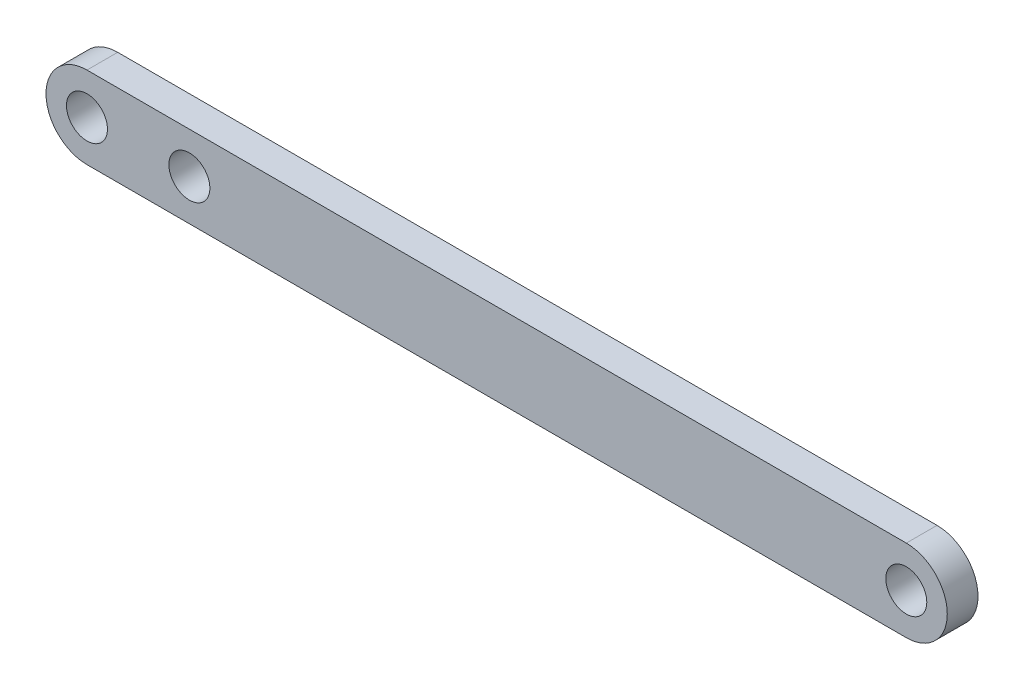
ISO-10303-21;
HEADER;
FILE_DESCRIPTION(('STEP AP214'),'2;1');
FILE_NAME('part.step','',(''),(''),'','','');
FILE_SCHEMA(('AUTOMOTIVE_DESIGN { 1 0 10303 214 1 1 1 1 }'));
ENDSEC;
DATA;
#1=APPLICATION_CONTEXT('core data for automotive mechanical design processes');
#2=APPLICATION_PROTOCOL_DEFINITION('international standard','automotive_design',2000,#1);
#3=PRODUCT_CONTEXT('',#1,'mechanical');
#4=PRODUCT('Part','Part','',(#3));
#5=PRODUCT_RELATED_PRODUCT_CATEGORY('part','',(#4));
#6=PRODUCT_DEFINITION_FORMATION('','',#4);
#7=PRODUCT_DEFINITION_CONTEXT('part definition',#1,'design');
#8=PRODUCT_DEFINITION('design','',#6,#7);
#9=PRODUCT_DEFINITION_SHAPE('','',#8);
#10=(LENGTH_UNIT() NAMED_UNIT(*) SI_UNIT(.MILLI.,.METRE.));
#11=(NAMED_UNIT(*) PLANE_ANGLE_UNIT() SI_UNIT($,.RADIAN.));
#12=(NAMED_UNIT(*) SI_UNIT($,.STERADIAN.) SOLID_ANGLE_UNIT());
#13=UNCERTAINTY_MEASURE_WITH_UNIT(LENGTH_MEASURE(1.E-05),#10,'distance_accuracy_value','');
#14=(GEOMETRIC_REPRESENTATION_CONTEXT(3) GLOBAL_UNCERTAINTY_ASSIGNED_CONTEXT((#13)) GLOBAL_UNIT_ASSIGNED_CONTEXT((#10,
#11,#12)) REPRESENTATION_CONTEXT('',''));
#15=CARTESIAN_POINT('',(0.,0.,0.));
#16=DIRECTION('',(0.,0.,1.));
#17=DIRECTION('',(1.,0.,0.));
#18=AXIS2_PLACEMENT_3D('',#15,#16,#17);
#19=CARTESIAN_POINT('',(0.,0.,1.5));
#20=DIRECTION('',(0.,0.,1.));
#21=DIRECTION('',(1.,0.,0.));
#22=AXIS2_PLACEMENT_3D('',#19,#20,#21);
#23=PLANE('',#22);
#24=CARTESIAN_POINT('',(40.,0.,1.5));
#25=DIRECTION('',(0.,0.,1.));
#26=DIRECTION('',(1.,0.,0.));
#27=AXIS2_PLACEMENT_3D('',#24,#25,#26);
#28=CIRCLE('',#27,0.999999999999998);
#29=CARTESIAN_POINT('',(41.,0.,1.5));
#30=VERTEX_POINT('',#29);
#31=EDGE_CURVE('E116',#30,#30,#28,.T.);
#32=ORIENTED_EDGE('',*,*,#31,.F.);
#33=EDGE_LOOP('',(#32));
#34=FACE_BOUND('',#33,.T.);
#35=CARTESIAN_POINT('',(0.,0.,1.5));
#36=DIRECTION('',(0.,0.,1.));
#37=DIRECTION('',(1.,0.,0.));
#38=AXIS2_PLACEMENT_3D('',#35,#36,#37);
#39=CIRCLE('',#38,2.);
#40=CARTESIAN_POINT('',(0.,2.,1.5));
#41=VERTEX_POINT('',#40);
#42=CARTESIAN_POINT('',(0.,-2.,1.5));
#43=VERTEX_POINT('',#42);
#44=EDGE_CURVE('E86',#41,#43,#39,.T.);
#45=ORIENTED_EDGE('',*,*,#44,.T.);
#46=DIRECTION('',(1.,0.,0.));
#47=VECTOR('',#46,1.);
#48=CARTESIAN_POINT('',(0.,-2.,1.5));
#49=LINE('',#48,#47);
#50=CARTESIAN_POINT('',(40.,-2.,1.5));
#51=VERTEX_POINT('',#50);
#52=EDGE_CURVE('E81',#43,#51,#49,.T.);
#53=ORIENTED_EDGE('',*,*,#52,.T.);
#54=CARTESIAN_POINT('',(40.,0.,1.5));
#55=DIRECTION('',(0.,0.,1.));
#56=DIRECTION('',(1.,0.,0.));
#57=AXIS2_PLACEMENT_3D('',#54,#55,#56);
#58=CIRCLE('',#57,2.);
#59=CARTESIAN_POINT('',(40.,2.,1.5));
#60=VERTEX_POINT('',#59);
#61=EDGE_CURVE('E84',#51,#60,#58,.T.);
#62=ORIENTED_EDGE('',*,*,#61,.T.);
#63=DIRECTION('',(-1.,0.,0.));
#64=VECTOR('',#63,1.);
#65=CARTESIAN_POINT('',(0.,2.,1.5));
#66=LINE('',#65,#64);
#67=EDGE_CURVE('E51',#60,#41,#66,.T.);
#68=ORIENTED_EDGE('',*,*,#67,.T.);
#69=EDGE_LOOP('',(#45,#53,#62,#68));
#70=FACE_BOUND('',#69,.T.);
#71=CARTESIAN_POINT('',(5.,0.,1.5));
#72=DIRECTION('',(0.,0.,1.));
#73=DIRECTION('',(1.,0.,0.));
#74=AXIS2_PLACEMENT_3D('',#71,#72,#73);
#75=CIRCLE('',#74,1.);
#76=CARTESIAN_POINT('',(6.,0.,1.5));
#77=VERTEX_POINT('',#76);
#78=EDGE_CURVE('E101',#77,#77,#75,.T.);
#79=ORIENTED_EDGE('',*,*,#78,.F.);
#80=EDGE_LOOP('',(#79));
#81=FACE_BOUND('',#80,.T.);
#82=CARTESIAN_POINT('',(0.,0.,1.5));
#83=DIRECTION('',(0.,0.,1.));
#84=DIRECTION('',(1.,0.,0.));
#85=AXIS2_PLACEMENT_3D('',#82,#83,#84);
#86=CIRCLE('',#85,1.);
#87=CARTESIAN_POINT('',(1.,0.,1.5));
#88=VERTEX_POINT('',#87);
#89=EDGE_CURVE('E122',#88,#88,#86,.T.);
#90=ORIENTED_EDGE('',*,*,#89,.F.);
#91=EDGE_LOOP('',(#90));
#92=FACE_BOUND('',#91,.T.);
#93=ADVANCED_FACE('F34',(#34,#70,#81,#92),#23,.T.);
#94=CARTESIAN_POINT('',(0.,0.,0.));
#95=DIRECTION('',(0.,0.,1.));
#96=DIRECTION('',(1.,0.,0.));
#97=AXIS2_PLACEMENT_3D('',#94,#95,#96);
#98=PLANE('',#97);
#99=CARTESIAN_POINT('',(0.,0.,0.));
#100=DIRECTION('',(0.,0.,1.));
#101=DIRECTION('',(1.,0.,0.));
#102=AXIS2_PLACEMENT_3D('',#99,#100,#101);
#103=CIRCLE('',#102,2.);
#104=CARTESIAN_POINT('',(0.,2.,0.));
#105=VERTEX_POINT('',#104);
#106=CARTESIAN_POINT('',(0.,-2.,0.));
#107=VERTEX_POINT('',#106);
#108=EDGE_CURVE('E98',#105,#107,#103,.T.);
#109=ORIENTED_EDGE('',*,*,#108,.F.);
#110=DIRECTION('',(-1.,0.,0.));
#111=VECTOR('',#110,1.);
#112=CARTESIAN_POINT('',(0.,2.,0.));
#113=LINE('',#112,#111);
#114=CARTESIAN_POINT('',(40.,2.,0.));
#115=VERTEX_POINT('',#114);
#116=EDGE_CURVE('E74',#115,#105,#113,.T.);
#117=ORIENTED_EDGE('',*,*,#116,.F.);
#118=CARTESIAN_POINT('',(40.,0.,0.));
#119=DIRECTION('',(0.,0.,1.));
#120=DIRECTION('',(1.,0.,0.));
#121=AXIS2_PLACEMENT_3D('',#118,#119,#120);
#122=CIRCLE('',#121,2.);
#123=CARTESIAN_POINT('',(40.,-2.,0.));
#124=VERTEX_POINT('',#123);
#125=EDGE_CURVE('E68',#124,#115,#122,.T.);
#126=ORIENTED_EDGE('',*,*,#125,.F.);
#127=DIRECTION('',(1.,0.,0.));
#128=VECTOR('',#127,1.);
#129=CARTESIAN_POINT('',(0.,-2.,0.));
#130=LINE('',#129,#128);
#131=EDGE_CURVE('E90',#107,#124,#130,.T.);
#132=ORIENTED_EDGE('',*,*,#131,.F.);
#133=EDGE_LOOP('',(#109,#117,#126,#132));
#134=FACE_BOUND('',#133,.T.);
#135=CARTESIAN_POINT('',(5.,0.,0.));
#136=DIRECTION('',(0.,0.,1.));
#137=DIRECTION('',(1.,0.,0.));
#138=AXIS2_PLACEMENT_3D('',#135,#136,#137);
#139=CIRCLE('',#138,1.);
#140=CARTESIAN_POINT('',(6.,0.,0.));
#141=VERTEX_POINT('',#140);
#142=EDGE_CURVE('E113',#141,#141,#139,.T.);
#143=ORIENTED_EDGE('',*,*,#142,.T.);
#144=EDGE_LOOP('',(#143));
#145=FACE_BOUND('',#144,.T.);
#146=CARTESIAN_POINT('',(40.,0.,0.));
#147=DIRECTION('',(0.,0.,1.));
#148=DIRECTION('',(1.,0.,0.));
#149=AXIS2_PLACEMENT_3D('',#146,#147,#148);
#150=CIRCLE('',#149,0.999999999999998);
#151=CARTESIAN_POINT('',(41.,0.,0.));
#152=VERTEX_POINT('',#151);
#153=EDGE_CURVE('E119',#152,#152,#150,.T.);
#154=ORIENTED_EDGE('',*,*,#153,.T.);
#155=EDGE_LOOP('',(#154));
#156=FACE_BOUND('',#155,.T.);
#157=CARTESIAN_POINT('',(0.,0.,0.));
#158=DIRECTION('',(0.,0.,1.));
#159=DIRECTION('',(1.,0.,0.));
#160=AXIS2_PLACEMENT_3D('',#157,#158,#159);
#161=CIRCLE('',#160,1.);
#162=CARTESIAN_POINT('',(1.,0.,0.));
#163=VERTEX_POINT('',#162);
#164=EDGE_CURVE('E125',#163,#163,#161,.T.);
#165=ORIENTED_EDGE('',*,*,#164,.T.);
#166=EDGE_LOOP('',(#165));
#167=FACE_BOUND('',#166,.T.);
#168=ADVANCED_FACE('F109',(#134,#145,#156,#167),#98,.F.);
#169=CARTESIAN_POINT('',(0.,0.,1.5));
#170=DIRECTION('',(0.,0.,-1.));
#171=DIRECTION('',(-1.,0.,0.));
#172=AXIS2_PLACEMENT_3D('',#169,#170,#171);
#173=CYLINDRICAL_SURFACE('',#172,2.);
#174=ORIENTED_EDGE('',*,*,#108,.T.);
#175=DIRECTION('',(0.,0.,-1.));
#176=VECTOR('',#175,1.);
#177=CARTESIAN_POINT('',(0.,-2.,1.5));
#178=LINE('',#177,#176);
#179=EDGE_CURVE('E11',#43,#107,#178,.T.);
#180=ORIENTED_EDGE('',*,*,#179,.F.);
#181=ORIENTED_EDGE('',*,*,#44,.F.);
#182=DIRECTION('',(0.,0.,-1.));
#183=VECTOR('',#182,1.);
#184=CARTESIAN_POINT('',(0.,2.,1.5));
#185=LINE('',#184,#183);
#186=EDGE_CURVE('E94',#41,#105,#185,.T.);
#187=ORIENTED_EDGE('',*,*,#186,.T.);
#188=EDGE_LOOP('',(#174,#180,#181,#187));
#189=FACE_BOUND('',#188,.T.);
#190=ADVANCED_FACE('F36',(#189),#173,.T.);
#191=CARTESIAN_POINT('',(0.,-2.,1.5));
#192=DIRECTION('',(0.,1.,0.));
#193=DIRECTION('',(0.,0.,1.));
#194=AXIS2_PLACEMENT_3D('',#191,#192,#193);
#195=PLANE('',#194);
#196=ORIENTED_EDGE('',*,*,#131,.T.);
#197=DIRECTION('',(0.,0.,-1.));
#198=VECTOR('',#197,1.);
#199=CARTESIAN_POINT('',(40.,-2.,1.5));
#200=LINE('',#199,#198);
#201=EDGE_CURVE('E43',#51,#124,#200,.T.);
#202=ORIENTED_EDGE('',*,*,#201,.F.);
#203=ORIENTED_EDGE('',*,*,#52,.F.);
#204=ORIENTED_EDGE('',*,*,#179,.T.);
#205=EDGE_LOOP('',(#196,#202,#203,#204));
#206=FACE_BOUND('',#205,.T.);
#207=ADVANCED_FACE('F89',(#206),#195,.F.);
#208=CARTESIAN_POINT('',(40.,0.,1.5));
#209=DIRECTION('',(0.,0.,-1.));
#210=DIRECTION('',(-1.,0.,0.));
#211=AXIS2_PLACEMENT_3D('',#208,#209,#210);
#212=CYLINDRICAL_SURFACE('',#211,2.);
#213=ORIENTED_EDGE('',*,*,#125,.T.);
#214=DIRECTION('',(0.,0.,-1.));
#215=VECTOR('',#214,1.);
#216=CARTESIAN_POINT('',(40.,2.,1.5));
#217=LINE('',#216,#215);
#218=EDGE_CURVE('E91',#60,#115,#217,.T.);
#219=ORIENTED_EDGE('',*,*,#218,.F.);
#220=ORIENTED_EDGE('',*,*,#61,.F.);
#221=ORIENTED_EDGE('',*,*,#201,.T.);
#222=EDGE_LOOP('',(#213,#219,#220,#221));
#223=FACE_BOUND('',#222,.T.);
#224=ADVANCED_FACE('F92',(#223),#212,.T.);
#225=CARTESIAN_POINT('',(0.,2.,1.5));
#226=DIRECTION('',(0.,-1.,0.));
#227=DIRECTION('',(0.,0.,-1.));
#228=AXIS2_PLACEMENT_3D('',#225,#226,#227);
#229=PLANE('',#228);
#230=ORIENTED_EDGE('',*,*,#116,.T.);
#231=ORIENTED_EDGE('',*,*,#186,.F.);
#232=ORIENTED_EDGE('',*,*,#67,.F.);
#233=ORIENTED_EDGE('',*,*,#218,.T.);
#234=EDGE_LOOP('',(#230,#231,#232,#233));
#235=FACE_BOUND('',#234,.T.);
#236=ADVANCED_FACE('F106',(#235),#229,.F.);
#237=CARTESIAN_POINT('',(5.,0.,1.5));
#238=DIRECTION('',(0.,0.,-1.));
#239=DIRECTION('',(-1.,0.,0.));
#240=AXIS2_PLACEMENT_3D('',#237,#238,#239);
#241=CYLINDRICAL_SURFACE('',#240,1.);
#242=ORIENTED_EDGE('',*,*,#78,.T.);
#243=EDGE_LOOP('',(#242));
#244=FACE_BOUND('',#243,.T.);
#245=ORIENTED_EDGE('',*,*,#142,.F.);
#246=EDGE_LOOP('',(#245));
#247=FACE_BOUND('',#246,.T.);
#248=ADVANCED_FACE('F143',(#244,#247),#241,.F.);
#249=CARTESIAN_POINT('',(40.,0.,1.5));
#250=DIRECTION('',(0.,0.,-1.));
#251=DIRECTION('',(-1.,0.,0.));
#252=AXIS2_PLACEMENT_3D('',#249,#250,#251);
#253=CYLINDRICAL_SURFACE('',#252,0.999999999999998);
#254=ORIENTED_EDGE('',*,*,#31,.T.);
#255=EDGE_LOOP('',(#254));
#256=FACE_BOUND('',#255,.T.);
#257=ORIENTED_EDGE('',*,*,#153,.F.);
#258=EDGE_LOOP('',(#257));
#259=FACE_BOUND('',#258,.T.);
#260=ADVANCED_FACE('F189',(#256,#259),#253,.F.);
#261=CARTESIAN_POINT('',(0.,0.,1.5));
#262=DIRECTION('',(0.,0.,-1.));
#263=DIRECTION('',(-1.,0.,0.));
#264=AXIS2_PLACEMENT_3D('',#261,#262,#263);
#265=CYLINDRICAL_SURFACE('',#264,1.);
#266=ORIENTED_EDGE('',*,*,#89,.T.);
#267=EDGE_LOOP('',(#266));
#268=FACE_BOUND('',#267,.T.);
#269=ORIENTED_EDGE('',*,*,#164,.F.);
#270=EDGE_LOOP('',(#269));
#271=FACE_BOUND('',#270,.T.);
#272=ADVANCED_FACE('F131',(#268,#271),#265,.F.);
#273=CLOSED_SHELL('',(#93,#168,#190,#207,#224,#236,#248,#260,#272));
#274=MANIFOLD_SOLID_BREP('B2',#273);
#275=ADVANCED_BREP_SHAPE_REPRESENTATION('',(#18,#274),#14);
#276=SHAPE_DEFINITION_REPRESENTATION(#9,#275);
ENDSEC;
END-ISO-10303-21;
